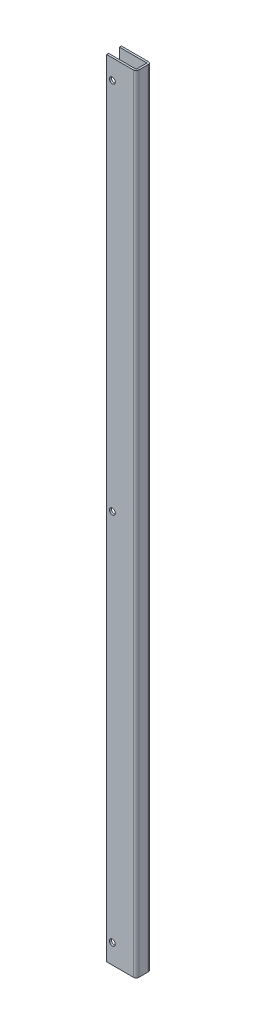
ISO-10303-21;
HEADER;
FILE_DESCRIPTION(('STEP AP214'),'2;1');
FILE_NAME('part.step','',(''),(''),'','','');
FILE_SCHEMA(('AUTOMOTIVE_DESIGN { 1 0 10303 214 1 1 1 1 }'));
ENDSEC;
DATA;
#1=APPLICATION_CONTEXT('core data for automotive mechanical design processes');
#2=APPLICATION_PROTOCOL_DEFINITION('international standard','automotive_design',2000,#1);
#3=PRODUCT_CONTEXT('',#1,'mechanical');
#4=PRODUCT('Part','Part','',(#3));
#5=PRODUCT_RELATED_PRODUCT_CATEGORY('part','',(#4));
#6=PRODUCT_DEFINITION_FORMATION('','',#4);
#7=PRODUCT_DEFINITION_CONTEXT('part definition',#1,'design');
#8=PRODUCT_DEFINITION('design','',#6,#7);
#9=PRODUCT_DEFINITION_SHAPE('','',#8);
#10=(LENGTH_UNIT() NAMED_UNIT(*) SI_UNIT(.MILLI.,.METRE.));
#11=(NAMED_UNIT(*) PLANE_ANGLE_UNIT() SI_UNIT($,.RADIAN.));
#12=(NAMED_UNIT(*) SI_UNIT($,.STERADIAN.) SOLID_ANGLE_UNIT());
#13=UNCERTAINTY_MEASURE_WITH_UNIT(LENGTH_MEASURE(1.E-05),#10,'distance_accuracy_value','');
#14=(GEOMETRIC_REPRESENTATION_CONTEXT(3) GLOBAL_UNCERTAINTY_ASSIGNED_CONTEXT((#13)) GLOBAL_UNIT_ASSIGNED_CONTEXT((#10,
#11,#12)) REPRESENTATION_CONTEXT('',''));
#15=CARTESIAN_POINT('',(0.,0.,0.));
#16=DIRECTION('',(0.,0.,1.));
#17=DIRECTION('',(1.,0.,0.));
#18=AXIS2_PLACEMENT_3D('',#15,#16,#17);
#19=CARTESIAN_POINT('',(15.,400.,13.));
#20=DIRECTION('',(0.,-1.,0.));
#21=DIRECTION('',(0.,0.,-1.));
#22=AXIS2_PLACEMENT_3D('',#19,#20,#21);
#23=PLANE('',#22);
#24=DIRECTION('',(1.,0.,0.));
#25=VECTOR('',#24,1.);
#26=CARTESIAN_POINT('',(13.,400.,10.2634));
#27=LINE('',#26,#25);
#28=CARTESIAN_POINT('',(13.,400.,10.2634));
#29=VERTEX_POINT('',#28);
#30=CARTESIAN_POINT('',(15.,400.,10.2634));
#31=VERTEX_POINT('',#30);
#32=EDGE_CURVE('E223',#29,#31,#27,.T.);
#33=ORIENTED_EDGE('',*,*,#32,.T.);
#34=DIRECTION('',(0.,0.,1.));
#35=VECTOR('',#34,1.);
#36=CARTESIAN_POINT('',(15.,400.,1.64901075554325E-12));
#37=LINE('',#36,#35);
#38=CARTESIAN_POINT('',(15.,400.,0.736599999999981));
#39=VERTEX_POINT('',#38);
#40=EDGE_CURVE('E242',#39,#31,#37,.T.);
#41=ORIENTED_EDGE('',*,*,#40,.F.);
#42=DIRECTION('',(-1.,0.,0.));
#43=VECTOR('',#42,1.);
#44=CARTESIAN_POINT('',(13.,400.,0.736599999999988));
#45=LINE('',#44,#43);
#46=CARTESIAN_POINT('',(13.,400.,0.736599999999993));
#47=VERTEX_POINT('',#46);
#48=EDGE_CURVE('E251',#47,#39,#45,.F.);
#49=ORIENTED_EDGE('',*,*,#48,.F.);
#50=DIRECTION('',(0.,0.,-1.));
#51=VECTOR('',#50,1.);
#52=CARTESIAN_POINT('',(13.,400.,13.));
#53=LINE('',#52,#51);
#54=EDGE_CURVE('E246',#47,#29,#53,.F.);
#55=ORIENTED_EDGE('',*,*,#54,.T.);
#56=EDGE_LOOP('',(#33,#41,#49,#55));
#57=FACE_BOUND('',#56,.T.);
#58=ADVANCED_FACE('F80',(#57),#23,.F.);
#59=CARTESIAN_POINT('',(15.,-400.,0.));
#60=DIRECTION('',(0.,1.,0.));
#61=DIRECTION('',(0.,0.,1.));
#62=AXIS2_PLACEMENT_3D('',#59,#60,#61);
#63=PLANE('',#62);
#64=DIRECTION('',(1.,-3.01445295852608E-13,0.));
#65=VECTOR('',#64,1.);
#66=CARTESIAN_POINT('',(13.,-400.,10.2634));
#67=LINE('',#66,#65);
#68=CARTESIAN_POINT('',(13.,-400.,10.2634));
#69=VERTEX_POINT('',#68);
#70=CARTESIAN_POINT('',(15.,-400.,10.2634));
#71=VERTEX_POINT('',#70);
#72=EDGE_CURVE('E233',#69,#71,#67,.T.);
#73=ORIENTED_EDGE('',*,*,#72,.F.);
#74=DIRECTION('',(0.,0.,1.));
#75=VECTOR('',#74,1.);
#76=CARTESIAN_POINT('',(13.,-400.,0.));
#77=LINE('',#76,#75);
#78=CARTESIAN_POINT('',(13.,-400.,0.736599999999993));
#79=VERTEX_POINT('',#78);
#80=EDGE_CURVE('E244',#69,#79,#77,.F.);
#81=ORIENTED_EDGE('',*,*,#80,.T.);
#82=DIRECTION('',(-1.,0.,0.));
#83=VECTOR('',#82,1.);
#84=CARTESIAN_POINT('',(15.,-400.,0.73659999999999));
#85=LINE('',#84,#83);
#86=CARTESIAN_POINT('',(15.,-400.,0.736599999999986));
#87=VERTEX_POINT('',#86);
#88=EDGE_CURVE('E236',#79,#87,#85,.F.);
#89=ORIENTED_EDGE('',*,*,#88,.T.);
#90=DIRECTION('',(0.,0.,-1.));
#91=VECTOR('',#90,1.);
#92=CARTESIAN_POINT('',(15.,-400.,0.));
#93=LINE('',#92,#91);
#94=EDGE_CURVE('E239',#71,#87,#93,.T.);
#95=ORIENTED_EDGE('',*,*,#94,.F.);
#96=EDGE_LOOP('',(#73,#81,#89,#95));
#97=FACE_BOUND('',#96,.T.);
#98=ADVANCED_FACE('F340',(#97),#63,.F.);
#99=CARTESIAN_POINT('',(15.,0.,0.));
#100=DIRECTION('',(-1.,0.,0.));
#101=DIRECTION('',(0.,0.,1.));
#102=AXIS2_PLACEMENT_3D('',#99,#100,#101);
#103=PLANE('',#102);
#104=DIRECTION('',(0.,1.,0.));
#105=VECTOR('',#104,1.);
#106=CARTESIAN_POINT('',(15.,400.,10.2634));
#107=LINE('',#106,#105);
#108=EDGE_CURVE('E217',#31,#71,#107,.F.);
#109=ORIENTED_EDGE('',*,*,#108,.T.);
#110=ORIENTED_EDGE('',*,*,#94,.T.);
#111=DIRECTION('',(0.,1.,0.));
#112=VECTOR('',#111,1.);
#113=CARTESIAN_POINT('',(15.,-400.,0.73659999999999));
#114=LINE('',#113,#112);
#115=EDGE_CURVE('E248',#39,#87,#114,.F.);
#116=ORIENTED_EDGE('',*,*,#115,.F.);
#117=ORIENTED_EDGE('',*,*,#40,.T.);
#118=EDGE_LOOP('',(#109,#110,#116,#117));
#119=FACE_BOUND('',#118,.T.);
#120=ADVANCED_FACE('F337',(#119),#103,.F.);
#121=CARTESIAN_POINT('',(13.,0.,0.));
#122=DIRECTION('',(-1.,0.,0.));
#123=DIRECTION('',(0.,0.,1.));
#124=AXIS2_PLACEMENT_3D('',#121,#122,#123);
#125=PLANE('',#124);
#126=ORIENTED_EDGE('',*,*,#80,.F.);
#127=DIRECTION('',(0.,1.,0.));
#128=VECTOR('',#127,1.);
#129=CARTESIAN_POINT('',(13.,400.,10.2634));
#130=LINE('',#129,#128);
#131=EDGE_CURVE('E97',#29,#69,#130,.F.);
#132=ORIENTED_EDGE('',*,*,#131,.F.);
#133=ORIENTED_EDGE('',*,*,#54,.F.);
#134=DIRECTION('',(0.,1.,0.));
#135=VECTOR('',#134,1.);
#136=CARTESIAN_POINT('',(13.,-400.,0.736599999999997));
#137=LINE('',#136,#135);
#138=EDGE_CURVE('E254',#79,#47,#137,.T.);
#139=ORIENTED_EDGE('',*,*,#138,.F.);
#140=EDGE_LOOP('',(#126,#132,#133,#139));
#141=FACE_BOUND('',#140,.T.);
#142=ADVANCED_FACE('F386',(#141),#125,.T.);
#143=CARTESIAN_POINT('',(15.,400.,-2.));
#144=DIRECTION('',(0.,1.,0.));
#145=DIRECTION('',(-1.,0.,0.));
#146=AXIS2_PLACEMENT_3D('',#143,#144,#145);
#147=PLANE('',#146);
#148=DIRECTION('',(-1.,0.,0.));
#149=VECTOR('',#148,1.);
#150=CARTESIAN_POINT('',(15.,400.,0.));
#151=LINE('',#150,#149);
#152=CARTESIAN_POINT('',(12.2634,400.,0.));
#153=VERTEX_POINT('',#152);
#154=CARTESIAN_POINT('',(-15.,400.,0.));
#155=VERTEX_POINT('',#154);
#156=EDGE_CURVE('E283',#153,#155,#151,.T.);
#157=ORIENTED_EDGE('',*,*,#156,.F.);
#158=DIRECTION('',(0.,0.,-1.));
#159=VECTOR('',#158,1.);
#160=CARTESIAN_POINT('',(12.2634,400.,0.));
#161=LINE('',#160,#159);
#162=CARTESIAN_POINT('',(12.2634,400.,-2.00000000000001));
#163=VERTEX_POINT('',#162);
#164=EDGE_CURVE('E264',#153,#163,#161,.T.);
#165=ORIENTED_EDGE('',*,*,#164,.T.);
#166=DIRECTION('',(-1.,0.,0.));
#167=VECTOR('',#166,1.);
#168=CARTESIAN_POINT('',(15.,400.,-2.));
#169=LINE('',#168,#167);
#170=CARTESIAN_POINT('',(-15.,400.,-2.));
#171=VERTEX_POINT('',#170);
#172=EDGE_CURVE('E286',#163,#171,#169,.T.);
#173=ORIENTED_EDGE('',*,*,#172,.T.);
#174=DIRECTION('',(0.,0.,1.));
#175=VECTOR('',#174,1.);
#176=CARTESIAN_POINT('',(-15.,400.,-2.));
#177=LINE('',#176,#175);
#178=EDGE_CURVE('E13',#171,#155,#177,.T.);
#179=ORIENTED_EDGE('',*,*,#178,.T.);
#180=EDGE_LOOP('',(#157,#165,#173,#179));
#181=FACE_BOUND('',#180,.T.);
#182=ADVANCED_FACE('F380',(#181),#147,.T.);
#183=CARTESIAN_POINT('',(0.,0.,-2.));
#184=DIRECTION('',(0.,0.,1.));
#185=DIRECTION('',(1.,0.,0.));
#186=AXIS2_PLACEMENT_3D('',#183,#184,#185);
#187=PLANE('',#186);
#188=CARTESIAN_POINT('',(-9.26000000000149,380.000000000001,-2.00000000000456));
#189=DIRECTION('',(0.,0.,-1.));
#190=DIRECTION('',(0.,1.,0.));
#191=AXIS2_PLACEMENT_3D('',#188,#189,#190);
#192=CIRCLE('',#191,3.);
#193=CARTESIAN_POINT('',(-9.26000000000149,383.000000000001,-2.00000000000459));
#194=VERTEX_POINT('',#193);
#195=EDGE_CURVE('E653',#194,#194,#192,.T.);
#196=ORIENTED_EDGE('',*,*,#195,.F.);
#197=EDGE_LOOP('',(#196));
#198=FACE_BOUND('',#197,.T.);
#199=CARTESIAN_POINT('',(-9.26000000000143,1.17317267012145E-12,-2.));
#200=DIRECTION('',(0.,0.,-1.));
#201=DIRECTION('',(0.,1.,0.));
#202=AXIS2_PLACEMENT_3D('',#199,#200,#201);
#203=CIRCLE('',#202,3.00000000000001);
#204=CARTESIAN_POINT('',(-9.26000000000143,3.00000000000118,-2.00000000000004));
#205=VERTEX_POINT('',#204);
#206=EDGE_CURVE('E659',#205,#205,#203,.T.);
#207=ORIENTED_EDGE('',*,*,#206,.F.);
#208=EDGE_LOOP('',(#207));
#209=FACE_BOUND('',#208,.T.);
#210=CARTESIAN_POINT('',(-9.26000000000143,-379.999999999999,-1.99999999999544));
#211=DIRECTION('',(0.,0.,-1.));
#212=DIRECTION('',(0.,1.,0.));
#213=AXIS2_PLACEMENT_3D('',#210,#211,#212);
#214=CIRCLE('',#213,3.);
#215=CARTESIAN_POINT('',(-9.26000000000143,-376.999999999999,-1.99999999999548));
#216=VERTEX_POINT('',#215);
#217=EDGE_CURVE('E310',#216,#216,#214,.T.);
#218=ORIENTED_EDGE('',*,*,#217,.F.);
#219=EDGE_LOOP('',(#218));
#220=FACE_BOUND('',#219,.T.);
#221=DIRECTION('',(0.,1.,0.));
#222=VECTOR('',#221,1.);
#223=CARTESIAN_POINT('',(12.2634,400.,-2.00000000000001));
#224=LINE('',#223,#222);
#225=CARTESIAN_POINT('',(12.2634,-400.,-2.));
#226=VERTEX_POINT('',#225);
#227=EDGE_CURVE('E258',#163,#226,#224,.F.);
#228=ORIENTED_EDGE('',*,*,#227,.T.);
#229=DIRECTION('',(1.,0.,0.));
#230=VECTOR('',#229,1.);
#231=CARTESIAN_POINT('',(15.,-400.,-2.));
#232=LINE('',#231,#230);
#233=CARTESIAN_POINT('',(-15.,-400.,-2.));
#234=VERTEX_POINT('',#233);
#235=EDGE_CURVE('E282',#234,#226,#232,.T.);
#236=ORIENTED_EDGE('',*,*,#235,.F.);
#237=DIRECTION('',(0.,-1.,0.));
#238=VECTOR('',#237,1.);
#239=CARTESIAN_POINT('',(-15.,-400.,-2.));
#240=LINE('',#239,#238);
#241=EDGE_CURVE('E279',#171,#234,#240,.T.);
#242=ORIENTED_EDGE('',*,*,#241,.F.);
#243=ORIENTED_EDGE('',*,*,#172,.F.);
#244=EDGE_LOOP('',(#228,#236,#242,#243));
#245=FACE_BOUND('',#244,.T.);
#246=ADVANCED_FACE('F376',(#198,#209,#220,#245),#187,.F.);
#247=CARTESIAN_POINT('',(0.,0.,0.));
#248=DIRECTION('',(0.,0.,1.));
#249=DIRECTION('',(1.,0.,0.));
#250=AXIS2_PLACEMENT_3D('',#247,#248,#249);
#251=PLANE('',#250);
#252=CARTESIAN_POINT('',(-9.26000000000149,380.000000000001,0.));
#253=DIRECTION('',(0.,0.,1.));
#254=DIRECTION('',(1.,0.,0.));
#255=AXIS2_PLACEMENT_3D('',#252,#253,#254);
#256=CIRCLE('',#255,3.);
#257=CARTESIAN_POINT('',(-6.26000000000149,380.000000000001,0.));
#258=VERTEX_POINT('',#257);
#259=EDGE_CURVE('E216',#258,#258,#256,.T.);
#260=ORIENTED_EDGE('',*,*,#259,.F.);
#261=EDGE_LOOP('',(#260));
#262=FACE_BOUND('',#261,.T.);
#263=CARTESIAN_POINT('',(-9.26000000000143,1.19715348745335E-12,0.));
#264=DIRECTION('',(0.,0.,1.));
#265=DIRECTION('',(1.,0.,0.));
#266=AXIS2_PLACEMENT_3D('',#263,#264,#265);
#267=CIRCLE('',#266,3.00000000000001);
#268=CARTESIAN_POINT('',(-6.26000000000143,1.19715348745335E-12,0.));
#269=VERTEX_POINT('',#268);
#270=EDGE_CURVE('E300',#269,#269,#267,.T.);
#271=ORIENTED_EDGE('',*,*,#270,.F.);
#272=EDGE_LOOP('',(#271));
#273=FACE_BOUND('',#272,.T.);
#274=CARTESIAN_POINT('',(-9.26000000000143,-379.999999999999,0.));
#275=DIRECTION('',(0.,0.,1.));
#276=DIRECTION('',(1.,0.,0.));
#277=AXIS2_PLACEMENT_3D('',#274,#275,#276);
#278=CIRCLE('',#277,3.);
#279=CARTESIAN_POINT('',(-6.26000000000143,-379.999999999999,0.));
#280=VERTEX_POINT('',#279);
#281=EDGE_CURVE('E296',#280,#280,#278,.T.);
#282=ORIENTED_EDGE('',*,*,#281,.F.);
#283=EDGE_LOOP('',(#282));
#284=FACE_BOUND('',#283,.T.);
#285=DIRECTION('',(1.,0.,0.));
#286=VECTOR('',#285,1.);
#287=CARTESIAN_POINT('',(15.,-400.,0.));
#288=LINE('',#287,#286);
#289=CARTESIAN_POINT('',(-15.,-400.,0.));
#290=VERTEX_POINT('',#289);
#291=CARTESIAN_POINT('',(12.2634,-400.,0.));
#292=VERTEX_POINT('',#291);
#293=EDGE_CURVE('E290',#290,#292,#288,.T.);
#294=ORIENTED_EDGE('',*,*,#293,.T.);
#295=DIRECTION('',(0.,1.,0.));
#296=VECTOR('',#295,1.);
#297=CARTESIAN_POINT('',(12.2634,400.,0.));
#298=LINE('',#297,#296);
#299=EDGE_CURVE('E105',#153,#292,#298,.F.);
#300=ORIENTED_EDGE('',*,*,#299,.F.);
#301=ORIENTED_EDGE('',*,*,#156,.T.);
#302=DIRECTION('',(0.,-1.,0.));
#303=VECTOR('',#302,1.);
#304=CARTESIAN_POINT('',(-15.,-400.,0.));
#305=LINE('',#304,#303);
#306=EDGE_CURVE('E276',#155,#290,#305,.T.);
#307=ORIENTED_EDGE('',*,*,#306,.T.);
#308=EDGE_LOOP('',(#294,#300,#301,#307));
#309=FACE_BOUND('',#308,.T.);
#310=ADVANCED_FACE('F379',(#262,#273,#284,#309),#251,.T.);
#311=CARTESIAN_POINT('',(-15.,-400.,-2.));
#312=DIRECTION('',(-1.,0.,0.));
#313=DIRECTION('',(0.,0.,1.));
#314=AXIS2_PLACEMENT_3D('',#311,#312,#313);
#315=PLANE('',#314);
#316=ORIENTED_EDGE('',*,*,#306,.F.);
#317=ORIENTED_EDGE('',*,*,#178,.F.);
#318=ORIENTED_EDGE('',*,*,#241,.T.);
#319=DIRECTION('',(0.,0.,1.));
#320=VECTOR('',#319,1.);
#321=CARTESIAN_POINT('',(-15.,-400.,-2.));
#322=LINE('',#321,#320);
#323=EDGE_CURVE('E89',#234,#290,#322,.T.);
#324=ORIENTED_EDGE('',*,*,#323,.T.);
#325=EDGE_LOOP('',(#316,#317,#318,#324));
#326=FACE_BOUND('',#325,.T.);
#327=ADVANCED_FACE('F82',(#326),#315,.T.);
#328=CARTESIAN_POINT('',(15.,-400.,-2.));
#329=DIRECTION('',(0.,-1.,0.));
#330=DIRECTION('',(0.,0.,-1.));
#331=AXIS2_PLACEMENT_3D('',#328,#329,#330);
#332=PLANE('',#331);
#333=DIRECTION('',(0.,0.,-1.));
#334=VECTOR('',#333,1.);
#335=CARTESIAN_POINT('',(12.2634,-400.,0.));
#336=LINE('',#335,#334);
#337=EDGE_CURVE('E273',#292,#226,#336,.T.);
#338=ORIENTED_EDGE('',*,*,#337,.F.);
#339=ORIENTED_EDGE('',*,*,#293,.F.);
#340=ORIENTED_EDGE('',*,*,#323,.F.);
#341=ORIENTED_EDGE('',*,*,#235,.T.);
#342=EDGE_LOOP('',(#338,#339,#340,#341));
#343=FACE_BOUND('',#342,.T.);
#344=ADVANCED_FACE('F371',(#343),#332,.T.);
#345=CARTESIAN_POINT('',(12.2634,-400.,0.736599999999995));
#346=DIRECTION('',(0.,-1.,0.));
#347=DIRECTION('',(0.,0.,-1.));
#348=AXIS2_PLACEMENT_3D('',#345,#346,#347);
#349=PLANE('',#348);
#350=ORIENTED_EDGE('',*,*,#88,.F.);
#351=CARTESIAN_POINT('',(12.2634,-400.,0.736599999999995));
#352=DIRECTION('',(0.,1.,0.));
#353=DIRECTION('',(0.,0.,1.));
#354=AXIS2_PLACEMENT_3D('',#351,#352,#353);
#355=CIRCLE('',#354,0.7366);
#356=EDGE_CURVE('E267',#292,#79,#355,.F.);
#357=ORIENTED_EDGE('',*,*,#356,.F.);
#358=ORIENTED_EDGE('',*,*,#337,.T.);
#359=CARTESIAN_POINT('',(12.2634,-400.,0.736599999999995));
#360=DIRECTION('',(0.,1.,0.));
#361=DIRECTION('',(0.,0.,1.));
#362=AXIS2_PLACEMENT_3D('',#359,#360,#361);
#363=CIRCLE('',#362,2.7366);
#364=EDGE_CURVE('E260',#226,#87,#363,.F.);
#365=ORIENTED_EDGE('',*,*,#364,.T.);
#366=EDGE_LOOP('',(#350,#357,#358,#365));
#367=FACE_BOUND('',#366,.T.);
#368=ADVANCED_FACE('F368',(#367),#349,.T.);
#369=CARTESIAN_POINT('',(12.2634,400.,0.736599999999995));
#370=DIRECTION('',(0.,-1.,0.));
#371=DIRECTION('',(0.,0.,-1.));
#372=AXIS2_PLACEMENT_3D('',#369,#370,#371);
#373=PLANE('',#372);
#374=CARTESIAN_POINT('',(12.2634,400.,0.736599999999995));
#375=DIRECTION('',(0.,1.,0.));
#376=DIRECTION('',(0.,0.,1.));
#377=AXIS2_PLACEMENT_3D('',#374,#375,#376);
#378=CIRCLE('',#377,0.7366);
#379=EDGE_CURVE('E241',#47,#153,#378,.T.);
#380=ORIENTED_EDGE('',*,*,#379,.F.);
#381=ORIENTED_EDGE('',*,*,#48,.T.);
#382=CARTESIAN_POINT('',(12.2634,400.,0.736599999999995));
#383=DIRECTION('',(0.,1.,0.));
#384=DIRECTION('',(0.,0.,1.));
#385=AXIS2_PLACEMENT_3D('',#382,#383,#384);
#386=CIRCLE('',#385,2.7366);
#387=EDGE_CURVE('E261',#39,#163,#386,.T.);
#388=ORIENTED_EDGE('',*,*,#387,.T.);
#389=ORIENTED_EDGE('',*,*,#164,.F.);
#390=EDGE_LOOP('',(#380,#381,#388,#389));
#391=FACE_BOUND('',#390,.T.);
#392=ADVANCED_FACE('F365',(#391),#373,.F.);
#393=CARTESIAN_POINT('',(12.2634,400.,0.736599999999995));
#394=DIRECTION('',(0.,1.,0.));
#395=DIRECTION('',(1.,0.,0.));
#396=AXIS2_PLACEMENT_3D('',#393,#394,#395);
#397=CYLINDRICAL_SURFACE('',#396,2.7366);
#398=ORIENTED_EDGE('',*,*,#227,.F.);
#399=ORIENTED_EDGE('',*,*,#387,.F.);
#400=ORIENTED_EDGE('',*,*,#115,.T.);
#401=ORIENTED_EDGE('',*,*,#364,.F.);
#402=EDGE_LOOP('',(#398,#399,#400,#401));
#403=FACE_BOUND('',#402,.T.);
#404=ADVANCED_FACE('F352',(#403),#397,.T.);
#405=CARTESIAN_POINT('',(12.2634,400.,0.736599999999995));
#406=DIRECTION('',(0.,1.,0.));
#407=DIRECTION('',(1.,0.,0.));
#408=AXIS2_PLACEMENT_3D('',#405,#406,#407);
#409=CYLINDRICAL_SURFACE('',#408,0.7366);
#410=ORIENTED_EDGE('',*,*,#299,.T.);
#411=ORIENTED_EDGE('',*,*,#356,.T.);
#412=ORIENTED_EDGE('',*,*,#138,.T.);
#413=ORIENTED_EDGE('',*,*,#379,.T.);
#414=EDGE_LOOP('',(#410,#411,#412,#413));
#415=FACE_BOUND('',#414,.T.);
#416=ADVANCED_FACE('F345',(#415),#409,.F.);
#417=CARTESIAN_POINT('',(12.2634,-400.,10.2634));
#418=DIRECTION('',(0.,-1.,0.));
#419=DIRECTION('',(0.,0.,-1.));
#420=AXIS2_PLACEMENT_3D('',#417,#418,#419);
#421=PLANE('',#420);
#422=DIRECTION('',(0.,0.,-1.));
#423=VECTOR('',#422,1.);
#424=CARTESIAN_POINT('',(12.2634,-400.,13.));
#425=LINE('',#424,#423);
#426=CARTESIAN_POINT('',(12.2634,-400.,11.));
#427=VERTEX_POINT('',#426);
#428=CARTESIAN_POINT('',(12.2634000000001,-399.999999999999,13.));
#429=VERTEX_POINT('',#428);
#430=EDGE_CURVE('E198',#427,#429,#425,.F.);
#431=ORIENTED_EDGE('',*,*,#430,.F.);
#432=CARTESIAN_POINT('',(12.2634,-400.,10.2634));
#433=DIRECTION('',(0.,1.,0.));
#434=DIRECTION('',(0.,0.,1.));
#435=AXIS2_PLACEMENT_3D('',#432,#433,#434);
#436=CIRCLE('',#435,0.7366);
#437=EDGE_CURVE('E226',#69,#427,#436,.F.);
#438=ORIENTED_EDGE('',*,*,#437,.F.);
#439=ORIENTED_EDGE('',*,*,#72,.T.);
#440=CARTESIAN_POINT('',(12.2634,-399.999999999999,10.2634));
#441=DIRECTION('',(0.,1.,0.));
#442=DIRECTION('',(0.,0.,1.));
#443=AXIS2_PLACEMENT_3D('',#440,#441,#442);
#444=CIRCLE('',#443,2.7366);
#445=EDGE_CURVE('E219',#71,#429,#444,.F.);
#446=ORIENTED_EDGE('',*,*,#445,.T.);
#447=EDGE_LOOP('',(#431,#438,#439,#446));
#448=FACE_BOUND('',#447,.T.);
#449=ADVANCED_FACE('F343',(#448),#421,.T.);
#450=CARTESIAN_POINT('',(12.2634,400.,10.2634));
#451=DIRECTION('',(0.,-1.,0.));
#452=DIRECTION('',(0.,0.,-1.));
#453=AXIS2_PLACEMENT_3D('',#450,#451,#452);
#454=PLANE('',#453);
#455=CARTESIAN_POINT('',(12.2634,400.,10.2634));
#456=DIRECTION('',(0.,1.,0.));
#457=DIRECTION('',(0.,0.,1.));
#458=AXIS2_PLACEMENT_3D('',#455,#456,#457);
#459=CIRCLE('',#458,0.7366);
#460=CARTESIAN_POINT('',(12.2634,400.,11.));
#461=VERTEX_POINT('',#460);
#462=EDGE_CURVE('E230',#461,#29,#459,.T.);
#463=ORIENTED_EDGE('',*,*,#462,.F.);
#464=DIRECTION('',(0.,0.,-1.));
#465=VECTOR('',#464,1.);
#466=CARTESIAN_POINT('',(12.2634,400.,11.));
#467=LINE('',#466,#465);
#468=CARTESIAN_POINT('',(12.2634,400.,13.));
#469=VERTEX_POINT('',#468);
#470=EDGE_CURVE('E210',#461,#469,#467,.F.);
#471=ORIENTED_EDGE('',*,*,#470,.T.);
#472=CARTESIAN_POINT('',(12.2634,400.,10.2634));
#473=DIRECTION('',(0.,1.,0.));
#474=DIRECTION('',(0.,0.,1.));
#475=AXIS2_PLACEMENT_3D('',#472,#473,#474);
#476=CIRCLE('',#475,2.7366);
#477=EDGE_CURVE('E220',#469,#31,#476,.T.);
#478=ORIENTED_EDGE('',*,*,#477,.T.);
#479=ORIENTED_EDGE('',*,*,#32,.F.);
#480=EDGE_LOOP('',(#463,#471,#478,#479));
#481=FACE_BOUND('',#480,.T.);
#482=ADVANCED_FACE('F327',(#481),#454,.F.);
#483=CARTESIAN_POINT('',(12.2634,400.,10.2634));
#484=DIRECTION('',(0.,1.,0.));
#485=DIRECTION('',(0.,0.,1.));
#486=AXIS2_PLACEMENT_3D('',#483,#484,#485);
#487=CYLINDRICAL_SURFACE('',#486,2.7366);
#488=ORIENTED_EDGE('',*,*,#108,.F.);
#489=ORIENTED_EDGE('',*,*,#477,.F.);
#490=DIRECTION('',(0.,1.,0.));
#491=VECTOR('',#490,1.);
#492=CARTESIAN_POINT('',(12.2634,-400.,13.));
#493=LINE('',#492,#491);
#494=EDGE_CURVE('E208',#469,#429,#493,.F.);
#495=ORIENTED_EDGE('',*,*,#494,.T.);
#496=ORIENTED_EDGE('',*,*,#445,.F.);
#497=EDGE_LOOP('',(#488,#489,#495,#496));
#498=FACE_BOUND('',#497,.T.);
#499=ADVANCED_FACE('F334',(#498),#487,.T.);
#500=CARTESIAN_POINT('',(12.2634,400.,10.2634));
#501=DIRECTION('',(0.,1.,0.));
#502=DIRECTION('',(0.,0.,1.));
#503=AXIS2_PLACEMENT_3D('',#500,#501,#502);
#504=CYLINDRICAL_SURFACE('',#503,0.7366);
#505=ORIENTED_EDGE('',*,*,#131,.T.);
#506=ORIENTED_EDGE('',*,*,#437,.T.);
#507=DIRECTION('',(0.,1.,0.));
#508=VECTOR('',#507,1.);
#509=CARTESIAN_POINT('',(12.2634,-400.,11.));
#510=LINE('',#509,#508);
#511=EDGE_CURVE('E213',#427,#461,#510,.T.);
#512=ORIENTED_EDGE('',*,*,#511,.T.);
#513=ORIENTED_EDGE('',*,*,#462,.T.);
#514=EDGE_LOOP('',(#505,#506,#512,#513));
#515=FACE_BOUND('',#514,.T.);
#516=ADVANCED_FACE('F323',(#515),#504,.F.);
#517=CARTESIAN_POINT('',(-15.,400.,13.0000000000002));
#518=DIRECTION('',(0.,-1.,0.));
#519=DIRECTION('',(0.,0.,-1.));
#520=AXIS2_PLACEMENT_3D('',#517,#518,#519);
#521=PLANE('',#520);
#522=ORIENTED_EDGE('',*,*,#470,.F.);
#523=DIRECTION('',(1.,0.,0.));
#524=VECTOR('',#523,1.);
#525=CARTESIAN_POINT('',(-15.,400.,11.0000000000002));
#526=LINE('',#525,#524);
#527=CARTESIAN_POINT('',(-15.,400.,11.0000000000002));
#528=VERTEX_POINT('',#527);
#529=EDGE_CURVE('E206',#461,#528,#526,.F.);
#530=ORIENTED_EDGE('',*,*,#529,.T.);
#531=DIRECTION('',(0.,0.,-1.));
#532=VECTOR('',#531,1.);
#533=CARTESIAN_POINT('',(-15.,400.,13.0000000000002));
#534=LINE('',#533,#532);
#535=CARTESIAN_POINT('',(-15.,400.,13.0000000000002));
#536=VERTEX_POINT('',#535);
#537=EDGE_CURVE('E194',#536,#528,#534,.T.);
#538=ORIENTED_EDGE('',*,*,#537,.F.);
#539=DIRECTION('',(-1.,0.,0.));
#540=VECTOR('',#539,1.);
#541=CARTESIAN_POINT('',(0.,400.,13.0000000000001));
#542=LINE('',#541,#540);
#543=EDGE_CURVE('E181',#469,#536,#542,.T.);
#544=ORIENTED_EDGE('',*,*,#543,.F.);
#545=EDGE_LOOP('',(#522,#530,#538,#544));
#546=FACE_BOUND('',#545,.T.);
#547=ADVANCED_FACE('F316',(#546),#521,.F.);
#548=CARTESIAN_POINT('',(13.,-400.,13.));
#549=DIRECTION('',(0.,1.,0.));
#550=DIRECTION('',(0.,0.,1.));
#551=AXIS2_PLACEMENT_3D('',#548,#549,#550);
#552=PLANE('',#551);
#553=ORIENTED_EDGE('',*,*,#430,.T.);
#554=DIRECTION('',(1.,0.,0.));
#555=VECTOR('',#554,1.);
#556=CARTESIAN_POINT('',(0.,-400.,13.0000000000001));
#557=LINE('',#556,#555);
#558=CARTESIAN_POINT('',(-15.,-400.,13.0000000000002));
#559=VERTEX_POINT('',#558);
#560=EDGE_CURVE('E179',#559,#429,#557,.T.);
#561=ORIENTED_EDGE('',*,*,#560,.F.);
#562=DIRECTION('',(0.,0.,-1.));
#563=VECTOR('',#562,1.);
#564=CARTESIAN_POINT('',(-15.,-400.,13.0000000000002));
#565=LINE('',#564,#563);
#566=CARTESIAN_POINT('',(-15.,-400.,11.0000000000002));
#567=VERTEX_POINT('',#566);
#568=EDGE_CURVE('E187',#559,#567,#565,.T.);
#569=ORIENTED_EDGE('',*,*,#568,.T.);
#570=DIRECTION('',(-1.,0.,0.));
#571=VECTOR('',#570,1.);
#572=CARTESIAN_POINT('',(13.,-400.,11.));
#573=LINE('',#572,#571);
#574=EDGE_CURVE('E203',#567,#427,#573,.F.);
#575=ORIENTED_EDGE('',*,*,#574,.T.);
#576=EDGE_LOOP('',(#553,#561,#569,#575));
#577=FACE_BOUND('',#576,.T.);
#578=ADVANCED_FACE('F197',(#577),#552,.F.);
#579=CARTESIAN_POINT('',(0.,0.,13.0000000000001));
#580=DIRECTION('',(0.,0.,-1.));
#581=DIRECTION('',(-1.,0.,0.));
#582=AXIS2_PLACEMENT_3D('',#579,#580,#581);
#583=PLANE('',#582);
#584=CARTESIAN_POINT('',(-9.26000000000149,380.000000000001,13.0000000000004));
#585=DIRECTION('',(0.,0.,-1.));
#586=DIRECTION('',(0.,1.,0.));
#587=AXIS2_PLACEMENT_3D('',#584,#585,#586);
#588=CIRCLE('',#587,3.);
#589=CARTESIAN_POINT('',(-9.26000000000149,383.000000000001,13.0000000000004));
#590=VERTEX_POINT('',#589);
#591=EDGE_CURVE('E297',#590,#590,#588,.T.);
#592=ORIENTED_EDGE('',*,*,#591,.T.);
#593=EDGE_LOOP('',(#592));
#594=FACE_BOUND('',#593,.T.);
#595=CARTESIAN_POINT('',(-9.26000000000143,1.35302880011078E-12,13.000000000005));
#596=DIRECTION('',(0.,0.,-1.));
#597=DIRECTION('',(0.,1.,0.));
#598=AXIS2_PLACEMENT_3D('',#595,#596,#597);
#599=CIRCLE('',#598,3.00000000000001);
#600=CARTESIAN_POINT('',(-9.26000000000143,3.00000000000136,13.000000000005));
#601=VERTEX_POINT('',#600);
#602=EDGE_CURVE('E654',#601,#601,#599,.T.);
#603=ORIENTED_EDGE('',*,*,#602,.T.);
#604=EDGE_LOOP('',(#603));
#605=FACE_BOUND('',#604,.T.);
#606=CARTESIAN_POINT('',(-9.26000000000143,-379.999999999999,13.0000000000096));
#607=DIRECTION('',(0.,0.,-1.));
#608=DIRECTION('',(0.,1.,0.));
#609=AXIS2_PLACEMENT_3D('',#606,#607,#608);
#610=CIRCLE('',#609,3.);
#611=CARTESIAN_POINT('',(-9.26000000000143,-376.999999999999,13.0000000000095));
#612=VERTEX_POINT('',#611);
#613=EDGE_CURVE('E663',#612,#612,#610,.T.);
#614=ORIENTED_EDGE('',*,*,#613,.T.);
#615=EDGE_LOOP('',(#614));
#616=FACE_BOUND('',#615,.T.);
#617=ORIENTED_EDGE('',*,*,#494,.F.);
#618=ORIENTED_EDGE('',*,*,#543,.T.);
#619=DIRECTION('',(0.,-1.,0.));
#620=VECTOR('',#619,1.);
#621=CARTESIAN_POINT('',(-15.,0.,13.0000000000002));
#622=LINE('',#621,#620);
#623=EDGE_CURVE('E174',#536,#559,#622,.T.);
#624=ORIENTED_EDGE('',*,*,#623,.T.);
#625=ORIENTED_EDGE('',*,*,#560,.T.);
#626=EDGE_LOOP('',(#617,#618,#624,#625));
#627=FACE_BOUND('',#626,.T.);
#628=ADVANCED_FACE('F177',(#594,#605,#616,#627),#583,.F.);
#629=CARTESIAN_POINT('',(0.,0.,11.0000000000001));
#630=DIRECTION('',(0.,0.,-1.));
#631=DIRECTION('',(-1.,0.,0.));
#632=AXIS2_PLACEMENT_3D('',#629,#630,#631);
#633=PLANE('',#632);
#634=CARTESIAN_POINT('',(-9.26000000000149,380.000000000001,11.0000000000002));
#635=DIRECTION('',(0.,0.,-1.));
#636=DIRECTION('',(-1.,0.,0.));
#637=AXIS2_PLACEMENT_3D('',#634,#635,#636);
#638=CIRCLE('',#637,3.);
#639=CARTESIAN_POINT('',(-12.2600000000015,380.000000000001,11.0000000000002));
#640=VERTEX_POINT('',#639);
#641=EDGE_CURVE('E84',#640,#640,#638,.T.);
#642=ORIENTED_EDGE('',*,*,#641,.F.);
#643=EDGE_LOOP('',(#642));
#644=FACE_BOUND('',#643,.T.);
#645=CARTESIAN_POINT('',(-9.26000000000143,1.32904798277882E-12,11.0000000000002));
#646=DIRECTION('',(0.,0.,-1.));
#647=DIRECTION('',(-1.,0.,0.));
#648=AXIS2_PLACEMENT_3D('',#645,#646,#647);
#649=CIRCLE('',#648,3.00000000000001);
#650=CARTESIAN_POINT('',(-12.2600000000014,1.32904798277882E-12,11.0000000000002));
#651=VERTEX_POINT('',#650);
#652=EDGE_CURVE('E298',#651,#651,#649,.T.);
#653=ORIENTED_EDGE('',*,*,#652,.F.);
#654=EDGE_LOOP('',(#653));
#655=FACE_BOUND('',#654,.T.);
#656=CARTESIAN_POINT('',(-9.26000000000143,-379.999999999999,11.0000000000002));
#657=DIRECTION('',(0.,0.,-1.));
#658=DIRECTION('',(-1.,0.,0.));
#659=AXIS2_PLACEMENT_3D('',#656,#657,#658);
#660=CIRCLE('',#659,3.);
#661=CARTESIAN_POINT('',(-12.2600000000014,-379.999999999999,11.0000000000002));
#662=VERTEX_POINT('',#661);
#663=EDGE_CURVE('E294',#662,#662,#660,.T.);
#664=ORIENTED_EDGE('',*,*,#663,.F.);
#665=EDGE_LOOP('',(#664));
#666=FACE_BOUND('',#665,.T.);
#667=ORIENTED_EDGE('',*,*,#529,.F.);
#668=ORIENTED_EDGE('',*,*,#511,.F.);
#669=ORIENTED_EDGE('',*,*,#574,.F.);
#670=DIRECTION('',(0.,1.,0.));
#671=VECTOR('',#670,1.);
#672=CARTESIAN_POINT('',(-15.,-400.,11.0000000000002));
#673=LINE('',#672,#671);
#674=EDGE_CURVE('E190',#528,#567,#673,.F.);
#675=ORIENTED_EDGE('',*,*,#674,.F.);
#676=EDGE_LOOP('',(#667,#668,#669,#675));
#677=FACE_BOUND('',#676,.T.);
#678=ADVANCED_FACE('F320',(#644,#655,#666,#677),#633,.T.);
#679=CARTESIAN_POINT('',(-15.,-400.,13.0000000000002));
#680=DIRECTION('',(1.,0.,0.));
#681=DIRECTION('',(0.,0.,-1.));
#682=AXIS2_PLACEMENT_3D('',#679,#680,#681);
#683=PLANE('',#682);
#684=ORIENTED_EDGE('',*,*,#674,.T.);
#685=ORIENTED_EDGE('',*,*,#568,.F.);
#686=ORIENTED_EDGE('',*,*,#623,.F.);
#687=ORIENTED_EDGE('',*,*,#537,.T.);
#688=EDGE_LOOP('',(#684,#685,#686,#687));
#689=FACE_BOUND('',#688,.T.);
#690=ADVANCED_FACE('F188',(#689),#683,.F.);
#691=CARTESIAN_POINT('',(-9.26000000000143,-379.999999999999,13.0000000000096));
#692=DIRECTION('',(0.,0.,-1.));
#693=DIRECTION('',(0.,1.,0.));
#694=AXIS2_PLACEMENT_3D('',#691,#692,#693);
#695=CYLINDRICAL_SURFACE('',#694,3.);
#696=ORIENTED_EDGE('',*,*,#663,.T.);
#697=EDGE_LOOP('',(#696));
#698=FACE_BOUND('',#697,.T.);
#699=ORIENTED_EDGE('',*,*,#613,.F.);
#700=EDGE_LOOP('',(#699));
#701=FACE_BOUND('',#700,.T.);
#702=ADVANCED_FACE('F487',(#698,#701),#695,.F.);
#703=CARTESIAN_POINT('',(-9.26000000000143,1.35302880011078E-12,13.000000000005));
#704=DIRECTION('',(0.,0.,-1.));
#705=DIRECTION('',(0.,1.,0.));
#706=AXIS2_PLACEMENT_3D('',#703,#704,#705);
#707=CYLINDRICAL_SURFACE('',#706,3.00000000000001);
#708=ORIENTED_EDGE('',*,*,#652,.T.);
#709=EDGE_LOOP('',(#708));
#710=FACE_BOUND('',#709,.T.);
#711=ORIENTED_EDGE('',*,*,#602,.F.);
#712=EDGE_LOOP('',(#711));
#713=FACE_BOUND('',#712,.T.);
#714=ADVANCED_FACE('F584',(#710,#713),#707,.F.);
#715=CARTESIAN_POINT('',(-9.26000000000149,380.000000000001,13.0000000000004));
#716=DIRECTION('',(0.,0.,-1.));
#717=DIRECTION('',(0.,1.,0.));
#718=AXIS2_PLACEMENT_3D('',#715,#716,#717);
#719=CYLINDRICAL_SURFACE('',#718,3.);
#720=ORIENTED_EDGE('',*,*,#641,.T.);
#721=EDGE_LOOP('',(#720));
#722=FACE_BOUND('',#721,.T.);
#723=ORIENTED_EDGE('',*,*,#591,.F.);
#724=EDGE_LOOP('',(#723));
#725=FACE_BOUND('',#724,.T.);
#726=ADVANCED_FACE('F595',(#722,#725),#719,.F.);
#727=ORIENTED_EDGE('',*,*,#281,.T.);
#728=EDGE_LOOP('',(#727));
#729=FACE_BOUND('',#728,.T.);
#730=ORIENTED_EDGE('',*,*,#217,.T.);
#731=EDGE_LOOP('',(#730));
#732=FACE_BOUND('',#731,.T.);
#733=ADVANCED_FACE('F587',(#729,#732),#695,.F.);
#734=ORIENTED_EDGE('',*,*,#270,.T.);
#735=EDGE_LOOP('',(#734));
#736=FACE_BOUND('',#735,.T.);
#737=ORIENTED_EDGE('',*,*,#206,.T.);
#738=EDGE_LOOP('',(#737));
#739=FACE_BOUND('',#738,.T.);
#740=ADVANCED_FACE('F597',(#736,#739),#707,.F.);
#741=ORIENTED_EDGE('',*,*,#259,.T.);
#742=EDGE_LOOP('',(#741));
#743=FACE_BOUND('',#742,.T.);
#744=ORIENTED_EDGE('',*,*,#195,.T.);
#745=EDGE_LOOP('',(#744));
#746=FACE_BOUND('',#745,.T.);
#747=ADVANCED_FACE('F607',(#743,#746),#719,.F.);
#748=CLOSED_SHELL('',(#58,#98,#120,#142,#182,#246,#310,#327,#344,#368,#392,#404,#416,#449,#482,
#499,#516,#547,#578,#628,#678,#690,#702,#714,#726,#733,#740,#747));
#749=MANIFOLD_SOLID_BREP('B2',#748);
#750=ADVANCED_BREP_SHAPE_REPRESENTATION('',(#18,#749),#14);
#751=SHAPE_DEFINITION_REPRESENTATION(#9,#750);
ENDSEC;
END-ISO-10303-21;
